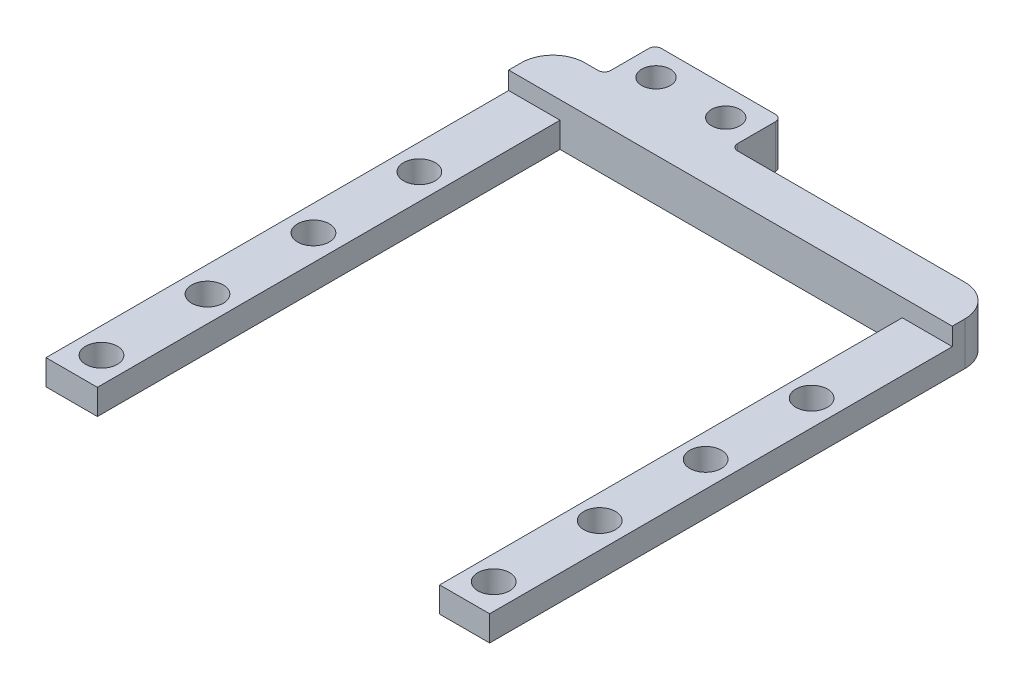
ISO-10303-21;
HEADER;
FILE_DESCRIPTION(('STEP AP214'),'2;1');
FILE_NAME('part.step','',(''),(''),'','','');
FILE_SCHEMA(('AUTOMOTIVE_DESIGN { 1 0 10303 214 1 1 1 1 }'));
ENDSEC;
DATA;
#1=APPLICATION_CONTEXT('core data for automotive mechanical design processes');
#2=APPLICATION_PROTOCOL_DEFINITION('international standard','automotive_design',2000,#1);
#3=PRODUCT_CONTEXT('',#1,'mechanical');
#4=PRODUCT('Part','Part','',(#3));
#5=PRODUCT_RELATED_PRODUCT_CATEGORY('part','',(#4));
#6=PRODUCT_DEFINITION_FORMATION('','',#4);
#7=PRODUCT_DEFINITION_CONTEXT('part definition',#1,'design');
#8=PRODUCT_DEFINITION('design','',#6,#7);
#9=PRODUCT_DEFINITION_SHAPE('','',#8);
#10=(LENGTH_UNIT() NAMED_UNIT(*) SI_UNIT(.MILLI.,.METRE.));
#11=(NAMED_UNIT(*) PLANE_ANGLE_UNIT() SI_UNIT($,.RADIAN.));
#12=(NAMED_UNIT(*) SI_UNIT($,.STERADIAN.) SOLID_ANGLE_UNIT());
#13=UNCERTAINTY_MEASURE_WITH_UNIT(LENGTH_MEASURE(1.E-05),#10,'distance_accuracy_value','');
#14=(GEOMETRIC_REPRESENTATION_CONTEXT(3) GLOBAL_UNCERTAINTY_ASSIGNED_CONTEXT((#13)) GLOBAL_UNIT_ASSIGNED_CONTEXT((#10,
#11,#12)) REPRESENTATION_CONTEXT('',''));
#15=CARTESIAN_POINT('',(0.,0.,0.));
#16=DIRECTION('',(0.,0.,1.));
#17=DIRECTION('',(1.,0.,0.));
#18=AXIS2_PLACEMENT_3D('',#15,#16,#17);
#19=CARTESIAN_POINT('',(0.,6.8,0.));
#20=DIRECTION('',(0.,0.,-1.));
#21=DIRECTION('',(-1.,0.,0.));
#22=AXIS2_PLACEMENT_3D('',#19,#20,#21);
#23=PLANE('',#22);
#24=DIRECTION('',(1.,0.,0.));
#25=VECTOR('',#24,1.);
#26=CARTESIAN_POINT('',(0.,6.8,0.));
#27=LINE('',#26,#25);
#28=CARTESIAN_POINT('',(29.11,6.8,0.));
#29=VERTEX_POINT('',#28);
#30=CARTESIAN_POINT('',(65.,6.8,0.));
#31=VERTEX_POINT('',#30);
#32=EDGE_CURVE('E282',#29,#31,#27,.T.);
#33=ORIENTED_EDGE('',*,*,#32,.T.);
#34=DIRECTION('',(0.,-1.,0.));
#35=VECTOR('',#34,1.);
#36=CARTESIAN_POINT('',(65.,6.8,0.));
#37=LINE('',#36,#35);
#38=CARTESIAN_POINT('',(65.,0.,0.));
#39=VERTEX_POINT('',#38);
#40=EDGE_CURVE('E45',#31,#39,#37,.T.);
#41=ORIENTED_EDGE('',*,*,#40,.T.);
#42=DIRECTION('',(1.,0.,0.));
#43=VECTOR('',#42,1.);
#44=CARTESIAN_POINT('',(0.,0.,0.));
#45=LINE('',#44,#43);
#46=CARTESIAN_POINT('',(29.11,0.,0.));
#47=VERTEX_POINT('',#46);
#48=EDGE_CURVE('E270',#47,#39,#45,.T.);
#49=ORIENTED_EDGE('',*,*,#48,.F.);
#50=DIRECTION('',(0.,1.,0.));
#51=VECTOR('',#50,1.);
#52=CARTESIAN_POINT('',(29.11,6.8,0.));
#53=LINE('',#52,#51);
#54=EDGE_CURVE('E336',#47,#29,#53,.T.);
#55=ORIENTED_EDGE('',*,*,#54,.T.);
#56=EDGE_LOOP('',(#33,#41,#49,#55));
#57=FACE_BOUND('',#56,.T.);
#58=ADVANCED_FACE('F37',(#57),#23,.T.);
#59=CARTESIAN_POINT('',(0.,6.8,0.));
#60=DIRECTION('',(0.,-1.,0.));
#61=DIRECTION('',(0.,0.,-1.));
#62=AXIS2_PLACEMENT_3D('',#59,#60,#61);
#63=PLANE('',#62);
#64=CARTESIAN_POINT('',(23.6256062550604,6.8,-3.62555008299355));
#65=DIRECTION('',(0.,1.,0.));
#66=DIRECTION('',(0.,0.,1.));
#67=AXIS2_PLACEMENT_3D('',#64,#65,#66);
#68=CIRCLE('',#67,2.25);
#69=CARTESIAN_POINT('',(23.6256062550604,6.8,-1.37555008299355));
#70=VERTEX_POINT('',#69);
#71=EDGE_CURVE('E411',#70,#70,#68,.T.);
#72=ORIENTED_EDGE('',*,*,#71,.F.);
#73=EDGE_LOOP('',(#72));
#74=FACE_BOUND('',#73,.T.);
#75=CARTESIAN_POINT('',(12.6256062550604,6.8,-3.62555008299355));
#76=DIRECTION('',(0.,1.,0.));
#77=DIRECTION('',(0.,0.,1.));
#78=AXIS2_PLACEMENT_3D('',#75,#76,#77);
#79=CIRCLE('',#78,2.25);
#80=CARTESIAN_POINT('',(12.6256062550604,6.8,-1.37555008299355));
#81=VERTEX_POINT('',#80);
#82=EDGE_CURVE('E405',#81,#81,#79,.T.);
#83=ORIENTED_EDGE('',*,*,#82,.F.);
#84=EDGE_LOOP('',(#83));
#85=FACE_BOUND('',#84,.T.);
#86=CARTESIAN_POINT('',(5.,6.8,0.));
#87=VERTEX_POINT('',#86);
#88=CARTESIAN_POINT('',(7.11000000000001,6.8,0.));
#89=VERTEX_POINT('',#88);
#90=EDGE_CURVE('E286',#87,#89,#27,.T.);
#91=ORIENTED_EDGE('',*,*,#90,.F.);
#92=CARTESIAN_POINT('',(5.,6.8,5.));
#93=DIRECTION('',(0.,-1.,0.));
#94=DIRECTION('',(0.,0.,-1.));
#95=AXIS2_PLACEMENT_3D('',#92,#93,#94);
#96=CIRCLE('',#95,5.);
#97=CARTESIAN_POINT('',(0.,6.8,5.));
#98=VERTEX_POINT('',#97);
#99=EDGE_CURVE('E294',#87,#98,#96,.F.);
#100=ORIENTED_EDGE('',*,*,#99,.T.);
#101=DIRECTION('',(0.,0.,1.));
#102=VECTOR('',#101,1.);
#103=CARTESIAN_POINT('',(0.,6.8,0.));
#104=LINE('',#103,#102);
#105=CARTESIAN_POINT('',(0.,6.8,7.00000000000001));
#106=VERTEX_POINT('',#105);
#107=EDGE_CURVE('E325',#98,#106,#104,.T.);
#108=ORIENTED_EDGE('',*,*,#107,.T.);
#109=DIRECTION('',(-1.,0.,0.));
#110=VECTOR('',#109,1.);
#111=CARTESIAN_POINT('',(8.11000000000001,6.8,7.00000000000001));
#112=LINE('',#111,#110);
#113=CARTESIAN_POINT('',(70.,6.8,7.00000000000001));
#114=VERTEX_POINT('',#113);
#115=EDGE_CURVE('E255',#114,#106,#112,.T.);
#116=ORIENTED_EDGE('',*,*,#115,.F.);
#117=DIRECTION('',(0.,0.,1.));
#118=VECTOR('',#117,1.);
#119=CARTESIAN_POINT('',(70.,6.8,0.));
#120=LINE('',#119,#118);
#121=CARTESIAN_POINT('',(70.,6.8,5.));
#122=VERTEX_POINT('',#121);
#123=EDGE_CURVE('E195',#122,#114,#120,.T.);
#124=ORIENTED_EDGE('',*,*,#123,.F.);
#125=CARTESIAN_POINT('',(65.,6.8,5.));
#126=DIRECTION('',(0.,-1.,0.));
#127=DIRECTION('',(0.,0.,-1.));
#128=AXIS2_PLACEMENT_3D('',#125,#126,#127);
#129=CIRCLE('',#128,5.);
#130=EDGE_CURVE('E52',#122,#31,#129,.F.);
#131=ORIENTED_EDGE('',*,*,#130,.T.);
#132=ORIENTED_EDGE('',*,*,#32,.F.);
#133=CARTESIAN_POINT('',(29.11,6.8,-1.));
#134=DIRECTION('',(0.,-1.,0.));
#135=DIRECTION('',(0.,0.,-1.));
#136=AXIS2_PLACEMENT_3D('',#133,#134,#135);
#137=CIRCLE('',#136,1.);
#138=CARTESIAN_POINT('',(28.11,6.8,-1.));
#139=VERTEX_POINT('',#138);
#140=EDGE_CURVE('E335',#29,#139,#137,.T.);
#141=ORIENTED_EDGE('',*,*,#140,.T.);
#142=DIRECTION('',(0.,0.,-1.));
#143=VECTOR('',#142,1.);
#144=CARTESIAN_POINT('',(28.11,6.8,0.));
#145=LINE('',#144,#143);
#146=CARTESIAN_POINT('',(28.11,6.8,-7.));
#147=VERTEX_POINT('',#146);
#148=EDGE_CURVE('E361',#139,#147,#145,.T.);
#149=ORIENTED_EDGE('',*,*,#148,.T.);
#150=CARTESIAN_POINT('',(27.11,6.8,-7.));
#151=DIRECTION('',(0.,-1.,0.));
#152=DIRECTION('',(0.,0.,-1.));
#153=AXIS2_PLACEMENT_3D('',#150,#151,#152);
#154=CIRCLE('',#153,1.);
#155=CARTESIAN_POINT('',(27.11,6.8,-8.));
#156=VERTEX_POINT('',#155);
#157=EDGE_CURVE('E357',#147,#156,#154,.F.);
#158=ORIENTED_EDGE('',*,*,#157,.T.);
#159=DIRECTION('',(1.,0.,0.));
#160=VECTOR('',#159,1.);
#161=CARTESIAN_POINT('',(8.11000000000001,6.8,-8.));
#162=LINE('',#161,#160);
#163=CARTESIAN_POINT('',(9.11000000000001,6.8,-8.));
#164=VERTEX_POINT('',#163);
#165=EDGE_CURVE('E364',#164,#156,#162,.T.);
#166=ORIENTED_EDGE('',*,*,#165,.F.);
#167=CARTESIAN_POINT('',(9.11000000000001,6.8,-7.));
#168=DIRECTION('',(0.,-1.,0.));
#169=DIRECTION('',(0.,0.,-1.));
#170=AXIS2_PLACEMENT_3D('',#167,#168,#169);
#171=CIRCLE('',#170,1.);
#172=CARTESIAN_POINT('',(8.11000000000001,6.8,-7.));
#173=VERTEX_POINT('',#172);
#174=EDGE_CURVE('E352',#164,#173,#171,.F.);
#175=ORIENTED_EDGE('',*,*,#174,.T.);
#176=DIRECTION('',(0.,0.,-1.));
#177=VECTOR('',#176,1.);
#178=CARTESIAN_POINT('',(8.11000000000001,6.8,0.));
#179=LINE('',#178,#177);
#180=CARTESIAN_POINT('',(8.11000000000001,6.8,-1.));
#181=VERTEX_POINT('',#180);
#182=EDGE_CURVE('E377',#181,#173,#179,.T.);
#183=ORIENTED_EDGE('',*,*,#182,.F.);
#184=CARTESIAN_POINT('',(7.11000000000001,6.8,-1.));
#185=DIRECTION('',(0.,-1.,0.));
#186=DIRECTION('',(0.,0.,-1.));
#187=AXIS2_PLACEMENT_3D('',#184,#185,#186);
#188=CIRCLE('',#187,1.);
#189=EDGE_CURVE('E385',#181,#89,#188,.T.);
#190=ORIENTED_EDGE('',*,*,#189,.T.);
#191=EDGE_LOOP('',(#91,#100,#108,#116,#124,#131,#132,#141,#149,#158,#166,#175,#183,#190));
#192=FACE_BOUND('',#191,.T.);
#193=ADVANCED_FACE('F400',(#74,#85,#192),#63,.F.);
#194=CARTESIAN_POINT('',(70.,6.8,0.));
#195=DIRECTION('',(1.,0.,0.));
#196=DIRECTION('',(0.,0.,-1.));
#197=AXIS2_PLACEMENT_3D('',#194,#195,#196);
#198=PLANE('',#197);
#199=DIRECTION('',(0.,0.,1.));
#200=VECTOR('',#199,1.);
#201=CARTESIAN_POINT('',(70.,0.,0.));
#202=LINE('',#201,#200);
#203=CARTESIAN_POINT('',(70.,0.,5.));
#204=VERTEX_POINT('',#203);
#205=CARTESIAN_POINT('',(70.,0.,80.));
#206=VERTEX_POINT('',#205);
#207=EDGE_CURVE('E313',#204,#206,#202,.T.);
#208=ORIENTED_EDGE('',*,*,#207,.F.);
#209=DIRECTION('',(0.,-1.,0.));
#210=VECTOR('',#209,1.);
#211=CARTESIAN_POINT('',(70.,6.8,5.));
#212=LINE('',#211,#210);
#213=EDGE_CURVE('E11',#204,#122,#212,.F.);
#214=ORIENTED_EDGE('',*,*,#213,.T.);
#215=ORIENTED_EDGE('',*,*,#123,.T.);
#216=DIRECTION('',(0.,1.,0.));
#217=VECTOR('',#216,1.);
#218=CARTESIAN_POINT('',(70.,4.,7.00000000000001));
#219=LINE('',#218,#217);
#220=CARTESIAN_POINT('',(70.,4.,7.00000000000001));
#221=VERTEX_POINT('',#220);
#222=EDGE_CURVE('E179',#221,#114,#219,.T.);
#223=ORIENTED_EDGE('',*,*,#222,.F.);
#224=DIRECTION('',(0.,0.,1.));
#225=VECTOR('',#224,1.);
#226=CARTESIAN_POINT('',(70.,4.,80.));
#227=LINE('',#226,#225);
#228=CARTESIAN_POINT('',(70.,4.,80.));
#229=VERTEX_POINT('',#228);
#230=EDGE_CURVE('E185',#221,#229,#227,.T.);
#231=ORIENTED_EDGE('',*,*,#230,.T.);
#232=DIRECTION('',(0.,-1.,0.));
#233=VECTOR('',#232,1.);
#234=CARTESIAN_POINT('',(70.,6.8,80.));
#235=LINE('',#234,#233);
#236=EDGE_CURVE('E470',#229,#206,#235,.T.);
#237=ORIENTED_EDGE('',*,*,#236,.T.);
#238=EDGE_LOOP('',(#208,#214,#215,#223,#231,#237));
#239=FACE_BOUND('',#238,.T.);
#240=ADVANCED_FACE('F194',(#239),#198,.T.);
#241=CARTESIAN_POINT('',(0.,0.,0.));
#242=DIRECTION('',(0.,-1.,0.));
#243=DIRECTION('',(0.,0.,-1.));
#244=AXIS2_PLACEMENT_3D('',#241,#242,#243);
#245=PLANE('',#244);
#246=CARTESIAN_POINT('',(23.6256062550604,0.,-3.62555008299355));
#247=DIRECTION('',(0.,1.,0.));
#248=DIRECTION('',(0.,0.,1.));
#249=AXIS2_PLACEMENT_3D('',#246,#247,#248);
#250=CIRCLE('',#249,2.25);
#251=CARTESIAN_POINT('',(23.6256062550604,0.,-1.37555008299355));
#252=VERTEX_POINT('',#251);
#253=EDGE_CURVE('E408',#252,#252,#250,.T.);
#254=ORIENTED_EDGE('',*,*,#253,.T.);
#255=EDGE_LOOP('',(#254));
#256=FACE_BOUND('',#255,.T.);
#257=CARTESIAN_POINT('',(12.6256062550604,0.,-3.62555008299355));
#258=DIRECTION('',(0.,1.,0.));
#259=DIRECTION('',(0.,0.,1.));
#260=AXIS2_PLACEMENT_3D('',#257,#258,#259);
#261=CIRCLE('',#260,2.25);
#262=CARTESIAN_POINT('',(12.6256062550604,0.,-1.37555008299355));
#263=VERTEX_POINT('',#262);
#264=EDGE_CURVE('E365',#263,#263,#261,.T.);
#265=ORIENTED_EDGE('',*,*,#264,.T.);
#266=EDGE_LOOP('',(#265));
#267=FACE_BOUND('',#266,.T.);
#268=CARTESIAN_POINT('',(65.945,0.,41.86));
#269=DIRECTION('',(0.,-1.,0.));
#270=DIRECTION('',(0.,0.,1.));
#271=AXIS2_PLACEMENT_3D('',#268,#269,#270);
#272=CIRCLE('',#271,2.5);
#273=CARTESIAN_POINT('',(65.945,0.,44.36));
#274=VERTEX_POINT('',#273);
#275=EDGE_CURVE('E240',#274,#274,#272,.T.);
#276=ORIENTED_EDGE('',*,*,#275,.F.);
#277=EDGE_LOOP('',(#276));
#278=FACE_BOUND('',#277,.T.);
#279=CARTESIAN_POINT('',(65.945,0.,75.3));
#280=DIRECTION('',(0.,-1.,0.));
#281=DIRECTION('',(0.,0.,1.));
#282=AXIS2_PLACEMENT_3D('',#279,#280,#281);
#283=CIRCLE('',#282,2.5);
#284=CARTESIAN_POINT('',(65.945,0.,77.8));
#285=VERTEX_POINT('',#284);
#286=EDGE_CURVE('E246',#285,#285,#283,.T.);
#287=ORIENTED_EDGE('',*,*,#286,.F.);
#288=EDGE_LOOP('',(#287));
#289=FACE_BOUND('',#288,.T.);
#290=CARTESIAN_POINT('',(4.05500000000001,0.,58.58));
#291=DIRECTION('',(0.,1.,0.));
#292=DIRECTION('',(0.,0.,1.));
#293=AXIS2_PLACEMENT_3D('',#290,#291,#292);
#294=CIRCLE('',#293,2.5);
#295=CARTESIAN_POINT('',(4.05500000000001,0.,61.08));
#296=VERTEX_POINT('',#295);
#297=EDGE_CURVE('E249',#296,#296,#294,.T.);
#298=ORIENTED_EDGE('',*,*,#297,.T.);
#299=EDGE_LOOP('',(#298));
#300=FACE_BOUND('',#299,.T.);
#301=CARTESIAN_POINT('',(4.05500000000001,0.,75.3));
#302=DIRECTION('',(0.,1.,0.));
#303=DIRECTION('',(0.,0.,1.));
#304=AXIS2_PLACEMENT_3D('',#301,#302,#303);
#305=CIRCLE('',#304,2.5);
#306=CARTESIAN_POINT('',(4.05500000000001,0.,77.8));
#307=VERTEX_POINT('',#306);
#308=EDGE_CURVE('E252',#307,#307,#305,.T.);
#309=ORIENTED_EDGE('',*,*,#308,.T.);
#310=EDGE_LOOP('',(#309));
#311=FACE_BOUND('',#310,.T.);
#312=DIRECTION('',(0.,0.,1.));
#313=VECTOR('',#312,1.);
#314=CARTESIAN_POINT('',(0.,0.,0.));
#315=LINE('',#314,#313);
#316=CARTESIAN_POINT('',(0.,0.,5.));
#317=VERTEX_POINT('',#316);
#318=CARTESIAN_POINT('',(0.,0.,80.));
#319=VERTEX_POINT('',#318);
#320=EDGE_CURVE('E526',#317,#319,#315,.T.);
#321=ORIENTED_EDGE('',*,*,#320,.F.);
#322=CARTESIAN_POINT('',(5.,0.,5.));
#323=DIRECTION('',(0.,-1.,0.));
#324=DIRECTION('',(0.,0.,-1.));
#325=AXIS2_PLACEMENT_3D('',#322,#323,#324);
#326=CIRCLE('',#325,5.);
#327=CARTESIAN_POINT('',(5.,0.,0.));
#328=VERTEX_POINT('',#327);
#329=EDGE_CURVE('E289',#317,#328,#326,.T.);
#330=ORIENTED_EDGE('',*,*,#329,.T.);
#331=CARTESIAN_POINT('',(7.11000000000001,0.,0.));
#332=VERTEX_POINT('',#331);
#333=EDGE_CURVE('E311',#328,#332,#45,.T.);
#334=ORIENTED_EDGE('',*,*,#333,.T.);
#335=CARTESIAN_POINT('',(7.11000000000001,0.,-1.));
#336=DIRECTION('',(0.,-1.,0.));
#337=DIRECTION('',(0.,0.,-1.));
#338=AXIS2_PLACEMENT_3D('',#335,#336,#337);
#339=CIRCLE('',#338,1.);
#340=CARTESIAN_POINT('',(8.11000000000001,0.,-1.));
#341=VERTEX_POINT('',#340);
#342=EDGE_CURVE('E388',#332,#341,#339,.F.);
#343=ORIENTED_EDGE('',*,*,#342,.T.);
#344=DIRECTION('',(0.,0.,-1.));
#345=VECTOR('',#344,1.);
#346=CARTESIAN_POINT('',(8.11000000000001,0.,0.));
#347=LINE('',#346,#345);
#348=CARTESIAN_POINT('',(8.11000000000001,0.,-7.));
#349=VERTEX_POINT('',#348);
#350=EDGE_CURVE('E192',#341,#349,#347,.T.);
#351=ORIENTED_EDGE('',*,*,#350,.T.);
#352=CARTESIAN_POINT('',(9.11000000000001,0.,-7.));
#353=DIRECTION('',(0.,-1.,0.));
#354=DIRECTION('',(0.,0.,-1.));
#355=AXIS2_PLACEMENT_3D('',#352,#353,#354);
#356=CIRCLE('',#355,1.);
#357=CARTESIAN_POINT('',(9.11000000000001,0.,-8.));
#358=VERTEX_POINT('',#357);
#359=EDGE_CURVE('E344',#349,#358,#356,.T.);
#360=ORIENTED_EDGE('',*,*,#359,.T.);
#361=DIRECTION('',(1.,0.,0.));
#362=VECTOR('',#361,1.);
#363=CARTESIAN_POINT('',(8.11000000000001,0.,-8.));
#364=LINE('',#363,#362);
#365=CARTESIAN_POINT('',(27.11,0.,-8.));
#366=VERTEX_POINT('',#365);
#367=EDGE_CURVE('E376',#358,#366,#364,.T.);
#368=ORIENTED_EDGE('',*,*,#367,.T.);
#369=CARTESIAN_POINT('',(27.11,0.,-7.));
#370=DIRECTION('',(0.,-1.,0.));
#371=DIRECTION('',(0.,0.,-1.));
#372=AXIS2_PLACEMENT_3D('',#369,#370,#371);
#373=CIRCLE('',#372,1.);
#374=CARTESIAN_POINT('',(28.11,0.,-7.));
#375=VERTEX_POINT('',#374);
#376=EDGE_CURVE('E321',#366,#375,#373,.T.);
#377=ORIENTED_EDGE('',*,*,#376,.T.);
#378=DIRECTION('',(0.,0.,-1.));
#379=VECTOR('',#378,1.);
#380=CARTESIAN_POINT('',(28.11,0.,0.));
#381=LINE('',#380,#379);
#382=CARTESIAN_POINT('',(28.11,0.,-1.));
#383=VERTEX_POINT('',#382);
#384=EDGE_CURVE('E318',#383,#375,#381,.T.);
#385=ORIENTED_EDGE('',*,*,#384,.F.);
#386=CARTESIAN_POINT('',(29.11,0.,-1.));
#387=DIRECTION('',(0.,-1.,0.));
#388=DIRECTION('',(0.,0.,-1.));
#389=AXIS2_PLACEMENT_3D('',#386,#387,#388);
#390=CIRCLE('',#389,1.);
#391=EDGE_CURVE('E310',#383,#47,#390,.F.);
#392=ORIENTED_EDGE('',*,*,#391,.T.);
#393=ORIENTED_EDGE('',*,*,#48,.T.);
#394=CARTESIAN_POINT('',(65.,0.,5.));
#395=DIRECTION('',(0.,-1.,0.));
#396=DIRECTION('',(0.,0.,-1.));
#397=AXIS2_PLACEMENT_3D('',#394,#395,#396);
#398=CIRCLE('',#397,5.);
#399=EDGE_CURVE('E307',#39,#204,#398,.T.);
#400=ORIENTED_EDGE('',*,*,#399,.T.);
#401=ORIENTED_EDGE('',*,*,#207,.T.);
#402=DIRECTION('',(1.,0.,0.));
#403=VECTOR('',#402,1.);
#404=CARTESIAN_POINT('',(0.,0.,80.));
#405=LINE('',#404,#403);
#406=CARTESIAN_POINT('',(62.11,0.,80.));
#407=VERTEX_POINT('',#406);
#408=EDGE_CURVE('E523',#407,#206,#405,.T.);
#409=ORIENTED_EDGE('',*,*,#408,.F.);
#410=DIRECTION('',(0.,0.,-1.));
#411=VECTOR('',#410,1.);
#412=CARTESIAN_POINT('',(62.11,0.,80.));
#413=LINE('',#412,#411);
#414=CARTESIAN_POINT('',(62.11,0.,7.00000000000001));
#415=VERTEX_POINT('',#414);
#416=EDGE_CURVE('E259',#407,#415,#413,.T.);
#417=ORIENTED_EDGE('',*,*,#416,.T.);
#418=DIRECTION('',(-1.,0.,0.));
#419=VECTOR('',#418,1.);
#420=CARTESIAN_POINT('',(8.11000000000001,0.,7.00000000000001));
#421=LINE('',#420,#419);
#422=CARTESIAN_POINT('',(8.11000000000001,0.,7.00000000000001));
#423=VERTEX_POINT('',#422);
#424=EDGE_CURVE('E262',#415,#423,#421,.T.);
#425=ORIENTED_EDGE('',*,*,#424,.T.);
#426=DIRECTION('',(0.,0.,1.));
#427=VECTOR('',#426,1.);
#428=CARTESIAN_POINT('',(8.11000000000001,0.,80.));
#429=LINE('',#428,#427);
#430=CARTESIAN_POINT('',(8.11000000000001,0.,80.));
#431=VERTEX_POINT('',#430);
#432=EDGE_CURVE('E256',#423,#431,#429,.T.);
#433=ORIENTED_EDGE('',*,*,#432,.T.);
#434=EDGE_CURVE('E524',#319,#431,#405,.T.);
#435=ORIENTED_EDGE('',*,*,#434,.F.);
#436=EDGE_LOOP('',(#321,#330,#334,#343,#351,#360,#368,#377,#385,#392,#393,#400,#401,#409,#417,
#425,#433,#435));
#437=FACE_BOUND('',#436,.T.);
#438=CARTESIAN_POINT('',(4.05500000000001,0.,41.86));
#439=DIRECTION('',(0.,1.,0.));
#440=DIRECTION('',(0.,0.,1.));
#441=AXIS2_PLACEMENT_3D('',#438,#439,#440);
#442=CIRCLE('',#441,2.5);
#443=CARTESIAN_POINT('',(4.05500000000001,0.,44.36));
#444=VERTEX_POINT('',#443);
#445=EDGE_CURVE('E475',#444,#444,#442,.T.);
#446=ORIENTED_EDGE('',*,*,#445,.T.);
#447=EDGE_LOOP('',(#446));
#448=FACE_BOUND('',#447,.T.);
#449=CARTESIAN_POINT('',(4.055,0.,25.14));
#450=DIRECTION('',(0.,1.,0.));
#451=DIRECTION('',(0.,0.,1.));
#452=AXIS2_PLACEMENT_3D('',#449,#450,#451);
#453=CIRCLE('',#452,2.5);
#454=CARTESIAN_POINT('',(4.055,0.,27.64));
#455=VERTEX_POINT('',#454);
#456=EDGE_CURVE('E382',#455,#455,#453,.T.);
#457=ORIENTED_EDGE('',*,*,#456,.T.);
#458=EDGE_LOOP('',(#457));
#459=FACE_BOUND('',#458,.T.);
#460=CARTESIAN_POINT('',(65.945,0.,58.58));
#461=DIRECTION('',(0.,-1.,0.));
#462=DIRECTION('',(0.,0.,1.));
#463=AXIS2_PLACEMENT_3D('',#460,#461,#462);
#464=CIRCLE('',#463,2.5);
#465=CARTESIAN_POINT('',(65.945,0.,61.08));
#466=VERTEX_POINT('',#465);
#467=EDGE_CURVE('E243',#466,#466,#464,.T.);
#468=ORIENTED_EDGE('',*,*,#467,.F.);
#469=EDGE_LOOP('',(#468));
#470=FACE_BOUND('',#469,.T.);
#471=CARTESIAN_POINT('',(65.945,0.,25.14));
#472=DIRECTION('',(0.,-1.,0.));
#473=DIRECTION('',(0.,0.,1.));
#474=AXIS2_PLACEMENT_3D('',#471,#472,#473);
#475=CIRCLE('',#474,2.5);
#476=CARTESIAN_POINT('',(65.945,0.,27.64));
#477=VERTEX_POINT('',#476);
#478=EDGE_CURVE('E237',#477,#477,#475,.T.);
#479=ORIENTED_EDGE('',*,*,#478,.F.);
#480=EDGE_LOOP('',(#479));
#481=FACE_BOUND('',#480,.T.);
#482=ADVANCED_FACE('F305',(#256,#267,#278,#289,#300,#311,#437,#448,#459,#470,#481),#245,.T.);
#483=CARTESIAN_POINT('',(0.,6.8,80.));
#484=DIRECTION('',(0.,0.,-1.));
#485=DIRECTION('',(-1.,0.,0.));
#486=AXIS2_PLACEMENT_3D('',#483,#484,#485);
#487=PLANE('',#486);
#488=DIRECTION('',(0.,1.,0.));
#489=VECTOR('',#488,1.);
#490=CARTESIAN_POINT('',(8.11000000000001,0.,80.));
#491=LINE('',#490,#489);
#492=CARTESIAN_POINT('',(8.11000000000001,4.,80.));
#493=VERTEX_POINT('',#492);
#494=EDGE_CURVE('E265',#431,#493,#491,.T.);
#495=ORIENTED_EDGE('',*,*,#494,.T.);
#496=DIRECTION('',(1.,0.,0.));
#497=VECTOR('',#496,1.);
#498=CARTESIAN_POINT('',(0.,4.,80.));
#499=LINE('',#498,#497);
#500=CARTESIAN_POINT('',(0.,4.,80.));
#501=VERTEX_POINT('',#500);
#502=EDGE_CURVE('E216',#501,#493,#499,.T.);
#503=ORIENTED_EDGE('',*,*,#502,.F.);
#504=DIRECTION('',(0.,-1.,0.));
#505=VECTOR('',#504,1.);
#506=CARTESIAN_POINT('',(0.,6.8,80.));
#507=LINE('',#506,#505);
#508=EDGE_CURVE('E471',#501,#319,#507,.T.);
#509=ORIENTED_EDGE('',*,*,#508,.T.);
#510=ORIENTED_EDGE('',*,*,#434,.T.);
#511=EDGE_LOOP('',(#495,#503,#509,#510));
#512=FACE_BOUND('',#511,.T.);
#513=ADVANCED_FACE('F452',(#512),#487,.F.);
#514=ORIENTED_EDGE('',*,*,#333,.F.);
#515=DIRECTION('',(0.,-1.,0.));
#516=VECTOR('',#515,1.);
#517=CARTESIAN_POINT('',(5.,6.8,0.));
#518=LINE('',#517,#516);
#519=EDGE_CURVE('E291',#328,#87,#518,.F.);
#520=ORIENTED_EDGE('',*,*,#519,.T.);
#521=ORIENTED_EDGE('',*,*,#90,.T.);
#522=DIRECTION('',(0.,1.,0.));
#523=VECTOR('',#522,1.);
#524=CARTESIAN_POINT('',(7.11000000000001,6.8,0.));
#525=LINE('',#524,#523);
#526=EDGE_CURVE('E381',#89,#332,#525,.F.);
#527=ORIENTED_EDGE('',*,*,#526,.T.);
#528=EDGE_LOOP('',(#514,#520,#521,#527));
#529=FACE_BOUND('',#528,.T.);
#530=ADVANCED_FACE('F445',(#529),#23,.T.);
#531=CARTESIAN_POINT('',(0.,6.8,0.));
#532=DIRECTION('',(1.,0.,0.));
#533=DIRECTION('',(0.,0.,-1.));
#534=AXIS2_PLACEMENT_3D('',#531,#532,#533);
#535=PLANE('',#534);
#536=ORIENTED_EDGE('',*,*,#107,.F.);
#537=DIRECTION('',(0.,-1.,0.));
#538=VECTOR('',#537,1.);
#539=CARTESIAN_POINT('',(0.,0.,5.));
#540=LINE('',#539,#538);
#541=EDGE_CURVE('E329',#98,#317,#540,.T.);
#542=ORIENTED_EDGE('',*,*,#541,.T.);
#543=ORIENTED_EDGE('',*,*,#320,.T.);
#544=ORIENTED_EDGE('',*,*,#508,.F.);
#545=DIRECTION('',(0.,0.,1.));
#546=VECTOR('',#545,1.);
#547=CARTESIAN_POINT('',(0.,4.,80.));
#548=LINE('',#547,#546);
#549=CARTESIAN_POINT('',(0.,4.,7.00000000000001));
#550=VERTEX_POINT('',#549);
#551=EDGE_CURVE('E214',#550,#501,#548,.T.);
#552=ORIENTED_EDGE('',*,*,#551,.F.);
#553=DIRECTION('',(0.,1.,0.));
#554=VECTOR('',#553,1.);
#555=CARTESIAN_POINT('',(0.,4.,7.00000000000001));
#556=LINE('',#555,#554);
#557=EDGE_CURVE('E224',#550,#106,#556,.T.);
#558=ORIENTED_EDGE('',*,*,#557,.T.);
#559=EDGE_LOOP('',(#536,#542,#543,#544,#552,#558));
#560=FACE_BOUND('',#559,.T.);
#561=ADVANCED_FACE('F451',(#560),#535,.F.);
#562=ORIENTED_EDGE('',*,*,#236,.F.);
#563=DIRECTION('',(-1.,0.,0.));
#564=VECTOR('',#563,1.);
#565=CARTESIAN_POINT('',(70.,4.,80.));
#566=LINE('',#565,#564);
#567=CARTESIAN_POINT('',(62.11,4.,80.));
#568=VERTEX_POINT('',#567);
#569=EDGE_CURVE('E184',#229,#568,#566,.T.);
#570=ORIENTED_EDGE('',*,*,#569,.T.);
#571=DIRECTION('',(0.,1.,0.));
#572=VECTOR('',#571,1.);
#573=CARTESIAN_POINT('',(62.11,0.,80.));
#574=LINE('',#573,#572);
#575=EDGE_CURVE('E272',#407,#568,#574,.T.);
#576=ORIENTED_EDGE('',*,*,#575,.F.);
#577=ORIENTED_EDGE('',*,*,#408,.T.);
#578=EDGE_LOOP('',(#562,#570,#576,#577));
#579=FACE_BOUND('',#578,.T.);
#580=ADVANCED_FACE('F458',(#579),#487,.F.);
#581=CARTESIAN_POINT('',(8.11000000000001,0.,80.));
#582=DIRECTION('',(-1.,0.,0.));
#583=DIRECTION('',(0.,0.,1.));
#584=AXIS2_PLACEMENT_3D('',#581,#582,#583);
#585=PLANE('',#584);
#586=DIRECTION('',(0.,1.,0.));
#587=VECTOR('',#586,1.);
#588=CARTESIAN_POINT('',(8.11000000000001,0.,7.00000000000001));
#589=LINE('',#588,#587);
#590=CARTESIAN_POINT('',(8.11000000000001,4.,7.00000000000001));
#591=VERTEX_POINT('',#590);
#592=EDGE_CURVE('E267',#423,#591,#589,.T.);
#593=ORIENTED_EDGE('',*,*,#592,.T.);
#594=DIRECTION('',(0.,0.,-1.));
#595=VECTOR('',#594,1.);
#596=CARTESIAN_POINT('',(8.11000000000001,4.,80.));
#597=LINE('',#596,#595);
#598=EDGE_CURVE('E218',#493,#591,#597,.T.);
#599=ORIENTED_EDGE('',*,*,#598,.F.);
#600=ORIENTED_EDGE('',*,*,#494,.F.);
#601=ORIENTED_EDGE('',*,*,#432,.F.);
#602=EDGE_LOOP('',(#593,#599,#600,#601));
#603=FACE_BOUND('',#602,.T.);
#604=ADVANCED_FACE('F515',(#603),#585,.F.);
#605=CARTESIAN_POINT('',(8.11000000000001,0.,7.00000000000001));
#606=DIRECTION('',(0.,0.,-1.));
#607=DIRECTION('',(-1.,0.,0.));
#608=AXIS2_PLACEMENT_3D('',#605,#606,#607);
#609=PLANE('',#608);
#610=ORIENTED_EDGE('',*,*,#115,.T.);
#611=ORIENTED_EDGE('',*,*,#557,.F.);
#612=DIRECTION('',(-1.,0.,0.));
#613=VECTOR('',#612,1.);
#614=CARTESIAN_POINT('',(0.,4.,7.00000000000001));
#615=LINE('',#614,#613);
#616=EDGE_CURVE('E221',#591,#550,#615,.T.);
#617=ORIENTED_EDGE('',*,*,#616,.F.);
#618=ORIENTED_EDGE('',*,*,#592,.F.);
#619=ORIENTED_EDGE('',*,*,#424,.F.);
#620=DIRECTION('',(0.,1.,0.));
#621=VECTOR('',#620,1.);
#622=CARTESIAN_POINT('',(62.11,0.,7.00000000000001));
#623=LINE('',#622,#621);
#624=CARTESIAN_POINT('',(62.11,4.,7.00000000000001));
#625=VERTEX_POINT('',#624);
#626=EDGE_CURVE('E181',#415,#625,#623,.T.);
#627=ORIENTED_EDGE('',*,*,#626,.T.);
#628=DIRECTION('',(1.,0.,0.));
#629=VECTOR('',#628,1.);
#630=CARTESIAN_POINT('',(70.,4.,7.00000000000001));
#631=LINE('',#630,#629);
#632=EDGE_CURVE('E174',#625,#221,#631,.T.);
#633=ORIENTED_EDGE('',*,*,#632,.T.);
#634=ORIENTED_EDGE('',*,*,#222,.T.);
#635=EDGE_LOOP('',(#610,#611,#617,#618,#619,#627,#633,#634));
#636=FACE_BOUND('',#635,.T.);
#637=ADVANCED_FACE('F177',(#636),#609,.F.);
#638=CARTESIAN_POINT('',(62.11,0.,80.));
#639=DIRECTION('',(1.,0.,0.));
#640=DIRECTION('',(0.,0.,-1.));
#641=AXIS2_PLACEMENT_3D('',#638,#639,#640);
#642=PLANE('',#641);
#643=ORIENTED_EDGE('',*,*,#575,.T.);
#644=DIRECTION('',(0.,0.,-1.));
#645=VECTOR('',#644,1.);
#646=CARTESIAN_POINT('',(62.11,4.,80.));
#647=LINE('',#646,#645);
#648=EDGE_CURVE('E212',#568,#625,#647,.T.);
#649=ORIENTED_EDGE('',*,*,#648,.T.);
#650=ORIENTED_EDGE('',*,*,#626,.F.);
#651=ORIENTED_EDGE('',*,*,#416,.F.);
#652=EDGE_LOOP('',(#643,#649,#650,#651));
#653=FACE_BOUND('',#652,.T.);
#654=ADVANCED_FACE('F504',(#653),#642,.F.);
#655=CARTESIAN_POINT('',(4.05500000000001,0.,75.3));
#656=DIRECTION('',(0.,1.,0.));
#657=DIRECTION('',(0.,0.,1.));
#658=AXIS2_PLACEMENT_3D('',#655,#656,#657);
#659=CYLINDRICAL_SURFACE('',#658,2.5);
#660=CARTESIAN_POINT('',(4.05500000000001,4.,75.3));
#661=DIRECTION('',(0.,-1.,0.));
#662=DIRECTION('',(0.,0.,-1.));
#663=AXIS2_PLACEMENT_3D('',#660,#661,#662);
#664=CIRCLE('',#663,2.5);
#665=CARTESIAN_POINT('',(4.05500000000001,4.,72.8));
#666=VERTEX_POINT('',#665);
#667=EDGE_CURVE('E234',#666,#666,#664,.F.);
#668=ORIENTED_EDGE('',*,*,#667,.T.);
#669=EDGE_LOOP('',(#668));
#670=FACE_BOUND('',#669,.T.);
#671=ORIENTED_EDGE('',*,*,#308,.F.);
#672=EDGE_LOOP('',(#671));
#673=FACE_BOUND('',#672,.T.);
#674=ADVANCED_FACE('F500',(#670,#673),#659,.F.);
#675=CARTESIAN_POINT('',(4.05500000000001,0.,58.58));
#676=DIRECTION('',(0.,1.,0.));
#677=DIRECTION('',(0.,0.,1.));
#678=AXIS2_PLACEMENT_3D('',#675,#676,#677);
#679=CYLINDRICAL_SURFACE('',#678,2.5);
#680=CARTESIAN_POINT('',(4.05500000000001,4.,58.58));
#681=DIRECTION('',(0.,-1.,0.));
#682=DIRECTION('',(0.,0.,-1.));
#683=AXIS2_PLACEMENT_3D('',#680,#681,#682);
#684=CIRCLE('',#683,2.5);
#685=CARTESIAN_POINT('',(4.05500000000001,4.,56.08));
#686=VERTEX_POINT('',#685);
#687=EDGE_CURVE('E231',#686,#686,#684,.F.);
#688=ORIENTED_EDGE('',*,*,#687,.T.);
#689=EDGE_LOOP('',(#688));
#690=FACE_BOUND('',#689,.T.);
#691=ORIENTED_EDGE('',*,*,#297,.F.);
#692=EDGE_LOOP('',(#691));
#693=FACE_BOUND('',#692,.T.);
#694=ADVANCED_FACE('F503',(#690,#693),#679,.F.);
#695=CARTESIAN_POINT('',(4.05500000000001,0.,41.86));
#696=DIRECTION('',(0.,1.,0.));
#697=DIRECTION('',(0.,0.,1.));
#698=AXIS2_PLACEMENT_3D('',#695,#696,#697);
#699=CYLINDRICAL_SURFACE('',#698,2.5);
#700=CARTESIAN_POINT('',(4.05500000000001,4.,41.86));
#701=DIRECTION('',(0.,-1.,0.));
#702=DIRECTION('',(0.,0.,-1.));
#703=AXIS2_PLACEMENT_3D('',#700,#701,#702);
#704=CIRCLE('',#703,2.5);
#705=CARTESIAN_POINT('',(4.05500000000001,4.,39.36));
#706=VERTEX_POINT('',#705);
#707=EDGE_CURVE('E228',#706,#706,#704,.F.);
#708=ORIENTED_EDGE('',*,*,#707,.T.);
#709=EDGE_LOOP('',(#708));
#710=FACE_BOUND('',#709,.T.);
#711=ORIENTED_EDGE('',*,*,#445,.F.);
#712=EDGE_LOOP('',(#711));
#713=FACE_BOUND('',#712,.T.);
#714=ADVANCED_FACE('F554',(#710,#713),#699,.F.);
#715=CARTESIAN_POINT('',(4.055,0.,25.14));
#716=DIRECTION('',(0.,1.,0.));
#717=DIRECTION('',(0.,0.,1.));
#718=AXIS2_PLACEMENT_3D('',#715,#716,#717);
#719=CYLINDRICAL_SURFACE('',#718,2.5);
#720=CARTESIAN_POINT('',(4.055,4.,25.14));
#721=DIRECTION('',(0.,-1.,0.));
#722=DIRECTION('',(0.,0.,-1.));
#723=AXIS2_PLACEMENT_3D('',#720,#721,#722);
#724=CIRCLE('',#723,2.5);
#725=CARTESIAN_POINT('',(4.055,4.,22.64));
#726=VERTEX_POINT('',#725);
#727=EDGE_CURVE('E227',#726,#726,#724,.F.);
#728=ORIENTED_EDGE('',*,*,#727,.T.);
#729=EDGE_LOOP('',(#728));
#730=FACE_BOUND('',#729,.T.);
#731=ORIENTED_EDGE('',*,*,#456,.F.);
#732=EDGE_LOOP('',(#731));
#733=FACE_BOUND('',#732,.T.);
#734=ADVANCED_FACE('F485',(#730,#733),#719,.F.);
#735=CARTESIAN_POINT('',(65.945,0.,75.3));
#736=DIRECTION('',(0.,1.,0.));
#737=DIRECTION('',(0.,0.,1.));
#738=AXIS2_PLACEMENT_3D('',#735,#736,#737);
#739=CYLINDRICAL_SURFACE('',#738,2.5);
#740=CARTESIAN_POINT('',(65.945,4.,75.3));
#741=DIRECTION('',(0.,-1.,0.));
#742=DIRECTION('',(0.,0.,-1.));
#743=AXIS2_PLACEMENT_3D('',#740,#741,#742);
#744=CIRCLE('',#743,2.5);
#745=CARTESIAN_POINT('',(65.945,4.,72.8));
#746=VERTEX_POINT('',#745);
#747=EDGE_CURVE('E209',#746,#746,#744,.T.);
#748=ORIENTED_EDGE('',*,*,#747,.F.);
#749=EDGE_LOOP('',(#748));
#750=FACE_BOUND('',#749,.T.);
#751=ORIENTED_EDGE('',*,*,#286,.T.);
#752=EDGE_LOOP('',(#751));
#753=FACE_BOUND('',#752,.T.);
#754=ADVANCED_FACE('F553',(#750,#753),#739,.F.);
#755=CARTESIAN_POINT('',(65.945,0.,58.58));
#756=DIRECTION('',(0.,1.,0.));
#757=DIRECTION('',(0.,0.,1.));
#758=AXIS2_PLACEMENT_3D('',#755,#756,#757);
#759=CYLINDRICAL_SURFACE('',#758,2.5);
#760=CARTESIAN_POINT('',(65.945,4.,58.58));
#761=DIRECTION('',(0.,-1.,0.));
#762=DIRECTION('',(0.,0.,-1.));
#763=AXIS2_PLACEMENT_3D('',#760,#761,#762);
#764=CIRCLE('',#763,2.5);
#765=CARTESIAN_POINT('',(65.945,4.,56.08));
#766=VERTEX_POINT('',#765);
#767=EDGE_CURVE('E206',#766,#766,#764,.T.);
#768=ORIENTED_EDGE('',*,*,#767,.F.);
#769=EDGE_LOOP('',(#768));
#770=FACE_BOUND('',#769,.T.);
#771=ORIENTED_EDGE('',*,*,#467,.T.);
#772=EDGE_LOOP('',(#771));
#773=FACE_BOUND('',#772,.T.);
#774=ADVANCED_FACE('F578',(#770,#773),#759,.F.);
#775=CARTESIAN_POINT('',(65.945,0.,41.86));
#776=DIRECTION('',(0.,1.,0.));
#777=DIRECTION('',(0.,0.,1.));
#778=AXIS2_PLACEMENT_3D('',#775,#776,#777);
#779=CYLINDRICAL_SURFACE('',#778,2.5);
#780=CARTESIAN_POINT('',(65.945,4.,41.86));
#781=DIRECTION('',(0.,-1.,0.));
#782=DIRECTION('',(0.,0.,-1.));
#783=AXIS2_PLACEMENT_3D('',#780,#781,#782);
#784=CIRCLE('',#783,2.5);
#785=CARTESIAN_POINT('',(65.945,4.,39.36));
#786=VERTEX_POINT('',#785);
#787=EDGE_CURVE('E200',#786,#786,#784,.T.);
#788=ORIENTED_EDGE('',*,*,#787,.F.);
#789=EDGE_LOOP('',(#788));
#790=FACE_BOUND('',#789,.T.);
#791=ORIENTED_EDGE('',*,*,#275,.T.);
#792=EDGE_LOOP('',(#791));
#793=FACE_BOUND('',#792,.T.);
#794=ADVANCED_FACE('F572',(#790,#793),#779,.F.);
#795=CARTESIAN_POINT('',(65.945,0.,25.14));
#796=DIRECTION('',(0.,1.,0.));
#797=DIRECTION('',(0.,0.,1.));
#798=AXIS2_PLACEMENT_3D('',#795,#796,#797);
#799=CYLINDRICAL_SURFACE('',#798,2.5);
#800=CARTESIAN_POINT('',(65.945,4.,25.14));
#801=DIRECTION('',(0.,-1.,0.));
#802=DIRECTION('',(0.,0.,-1.));
#803=AXIS2_PLACEMENT_3D('',#800,#801,#802);
#804=CIRCLE('',#803,2.5);
#805=CARTESIAN_POINT('',(65.945,4.,22.64));
#806=VERTEX_POINT('',#805);
#807=EDGE_CURVE('E197',#806,#806,#804,.T.);
#808=ORIENTED_EDGE('',*,*,#807,.F.);
#809=EDGE_LOOP('',(#808));
#810=FACE_BOUND('',#809,.T.);
#811=ORIENTED_EDGE('',*,*,#478,.T.);
#812=EDGE_LOOP('',(#811));
#813=FACE_BOUND('',#812,.T.);
#814=ADVANCED_FACE('F491',(#810,#813),#799,.F.);
#815=CARTESIAN_POINT('',(0.,4.,0.));
#816=DIRECTION('',(0.,-1.,0.));
#817=DIRECTION('',(0.,0.,-1.));
#818=AXIS2_PLACEMENT_3D('',#815,#816,#817);
#819=PLANE('',#818);
#820=ORIENTED_EDGE('',*,*,#687,.F.);
#821=EDGE_LOOP('',(#820));
#822=FACE_BOUND('',#821,.T.);
#823=ORIENTED_EDGE('',*,*,#727,.F.);
#824=EDGE_LOOP('',(#823));
#825=FACE_BOUND('',#824,.T.);
#826=ORIENTED_EDGE('',*,*,#551,.T.);
#827=ORIENTED_EDGE('',*,*,#502,.T.);
#828=ORIENTED_EDGE('',*,*,#598,.T.);
#829=ORIENTED_EDGE('',*,*,#616,.T.);
#830=EDGE_LOOP('',(#826,#827,#828,#829));
#831=FACE_BOUND('',#830,.T.);
#832=ORIENTED_EDGE('',*,*,#707,.F.);
#833=EDGE_LOOP('',(#832));
#834=FACE_BOUND('',#833,.T.);
#835=ORIENTED_EDGE('',*,*,#667,.F.);
#836=EDGE_LOOP('',(#835));
#837=FACE_BOUND('',#836,.T.);
#838=ADVANCED_FACE('F488',(#822,#825,#831,#834,#837),#819,.F.);
#839=CARTESIAN_POINT('',(70.,4.,0.));
#840=DIRECTION('',(0.,-1.,0.));
#841=DIRECTION('',(0.,0.,-1.));
#842=AXIS2_PLACEMENT_3D('',#839,#840,#841);
#843=PLANE('',#842);
#844=ORIENTED_EDGE('',*,*,#807,.T.);
#845=EDGE_LOOP('',(#844));
#846=FACE_BOUND('',#845,.T.);
#847=ORIENTED_EDGE('',*,*,#787,.T.);
#848=EDGE_LOOP('',(#847));
#849=FACE_BOUND('',#848,.T.);
#850=ORIENTED_EDGE('',*,*,#767,.T.);
#851=EDGE_LOOP('',(#850));
#852=FACE_BOUND('',#851,.T.);
#853=ORIENTED_EDGE('',*,*,#747,.T.);
#854=EDGE_LOOP('',(#853));
#855=FACE_BOUND('',#854,.T.);
#856=ORIENTED_EDGE('',*,*,#569,.F.);
#857=ORIENTED_EDGE('',*,*,#230,.F.);
#858=ORIENTED_EDGE('',*,*,#632,.F.);
#859=ORIENTED_EDGE('',*,*,#648,.F.);
#860=EDGE_LOOP('',(#856,#857,#858,#859));
#861=FACE_BOUND('',#860,.T.);
#862=ADVANCED_FACE('F188',(#846,#849,#852,#855,#861),#843,.F.);
#863=CARTESIAN_POINT('',(8.11000000000001,0.,0.));
#864=DIRECTION('',(1.,0.,0.));
#865=DIRECTION('',(0.,0.,-1.));
#866=AXIS2_PLACEMENT_3D('',#863,#864,#865);
#867=PLANE('',#866);
#868=ORIENTED_EDGE('',*,*,#182,.T.);
#869=DIRECTION('',(0.,1.,0.));
#870=VECTOR('',#869,1.);
#871=CARTESIAN_POINT('',(8.11000000000001,0.,-7.));
#872=LINE('',#871,#870);
#873=EDGE_CURVE('E349',#173,#349,#872,.F.);
#874=ORIENTED_EDGE('',*,*,#873,.T.);
#875=ORIENTED_EDGE('',*,*,#350,.F.);
#876=DIRECTION('',(0.,1.,0.));
#877=VECTOR('',#876,1.);
#878=CARTESIAN_POINT('',(8.11000000000001,0.,-1.));
#879=LINE('',#878,#877);
#880=EDGE_CURVE('E378',#341,#181,#879,.T.);
#881=ORIENTED_EDGE('',*,*,#880,.T.);
#882=EDGE_LOOP('',(#868,#874,#875,#881));
#883=FACE_BOUND('',#882,.T.);
#884=ADVANCED_FACE('F655',(#883),#867,.F.);
#885=CARTESIAN_POINT('',(8.11000000000001,0.,-8.));
#886=DIRECTION('',(0.,0.,1.));
#887=DIRECTION('',(1.,0.,0.));
#888=AXIS2_PLACEMENT_3D('',#885,#886,#887);
#889=PLANE('',#888);
#890=ORIENTED_EDGE('',*,*,#367,.F.);
#891=DIRECTION('',(0.,1.,0.));
#892=VECTOR('',#891,1.);
#893=CARTESIAN_POINT('',(9.11000000000001,0.,-8.));
#894=LINE('',#893,#892);
#895=EDGE_CURVE('E360',#358,#164,#894,.T.);
#896=ORIENTED_EDGE('',*,*,#895,.T.);
#897=ORIENTED_EDGE('',*,*,#165,.T.);
#898=DIRECTION('',(0.,1.,0.));
#899=VECTOR('',#898,1.);
#900=CARTESIAN_POINT('',(27.11,0.,-8.));
#901=LINE('',#900,#899);
#902=EDGE_CURVE('E390',#156,#366,#901,.F.);
#903=ORIENTED_EDGE('',*,*,#902,.T.);
#904=EDGE_LOOP('',(#890,#896,#897,#903));
#905=FACE_BOUND('',#904,.T.);
#906=ADVANCED_FACE('F396',(#905),#889,.F.);
#907=CARTESIAN_POINT('',(28.11,0.,0.));
#908=DIRECTION('',(1.,0.,0.));
#909=DIRECTION('',(0.,0.,-1.));
#910=AXIS2_PLACEMENT_3D('',#907,#908,#909);
#911=PLANE('',#910);
#912=ORIENTED_EDGE('',*,*,#384,.T.);
#913=DIRECTION('',(0.,1.,0.));
#914=VECTOR('',#913,1.);
#915=CARTESIAN_POINT('',(28.11,6.8,-7.));
#916=LINE('',#915,#914);
#917=EDGE_CURVE('E340',#375,#147,#916,.T.);
#918=ORIENTED_EDGE('',*,*,#917,.T.);
#919=ORIENTED_EDGE('',*,*,#148,.F.);
#920=DIRECTION('',(0.,1.,0.));
#921=VECTOR('',#920,1.);
#922=CARTESIAN_POINT('',(28.11,0.,-1.));
#923=LINE('',#922,#921);
#924=EDGE_CURVE('E343',#139,#383,#923,.F.);
#925=ORIENTED_EDGE('',*,*,#924,.T.);
#926=EDGE_LOOP('',(#912,#918,#919,#925));
#927=FACE_BOUND('',#926,.T.);
#928=ADVANCED_FACE('F433',(#927),#911,.T.);
#929=CARTESIAN_POINT('',(12.6256062550604,0.,-3.62555008299355));
#930=DIRECTION('',(0.,1.,0.));
#931=DIRECTION('',(0.,0.,1.));
#932=AXIS2_PLACEMENT_3D('',#929,#930,#931);
#933=CYLINDRICAL_SURFACE('',#932,2.25);
#934=ORIENTED_EDGE('',*,*,#264,.F.);
#935=EDGE_LOOP('',(#934));
#936=FACE_BOUND('',#935,.T.);
#937=ORIENTED_EDGE('',*,*,#82,.T.);
#938=EDGE_LOOP('',(#937));
#939=FACE_BOUND('',#938,.T.);
#940=ADVANCED_FACE('F423',(#936,#939),#933,.F.);
#941=CARTESIAN_POINT('',(23.6256062550604,0.,-3.62555008299355));
#942=DIRECTION('',(0.,1.,0.));
#943=DIRECTION('',(0.,0.,1.));
#944=AXIS2_PLACEMENT_3D('',#941,#942,#943);
#945=CYLINDRICAL_SURFACE('',#944,2.25);
#946=ORIENTED_EDGE('',*,*,#253,.F.);
#947=EDGE_LOOP('',(#946));
#948=FACE_BOUND('',#947,.T.);
#949=ORIENTED_EDGE('',*,*,#71,.T.);
#950=EDGE_LOOP('',(#949));
#951=FACE_BOUND('',#950,.T.);
#952=ADVANCED_FACE('F419',(#948,#951),#945,.F.);
#953=CARTESIAN_POINT('',(7.11000000000001,0.,-1.));
#954=DIRECTION('',(0.,1.,0.));
#955=DIRECTION('',(0.,0.,1.));
#956=AXIS2_PLACEMENT_3D('',#953,#954,#955);
#957=CYLINDRICAL_SURFACE('',#956,1.);
#958=ORIENTED_EDGE('',*,*,#342,.F.);
#959=ORIENTED_EDGE('',*,*,#526,.F.);
#960=ORIENTED_EDGE('',*,*,#189,.F.);
#961=ORIENTED_EDGE('',*,*,#880,.F.);
#962=EDGE_LOOP('',(#958,#959,#960,#961));
#963=FACE_BOUND('',#962,.T.);
#964=ADVANCED_FACE('F422',(#963),#957,.F.);
#965=CARTESIAN_POINT('',(9.11000000000001,0.,-7.));
#966=DIRECTION('',(0.,1.,0.));
#967=DIRECTION('',(0.,0.,1.));
#968=AXIS2_PLACEMENT_3D('',#965,#966,#967);
#969=CYLINDRICAL_SURFACE('',#968,1.);
#970=ORIENTED_EDGE('',*,*,#359,.F.);
#971=ORIENTED_EDGE('',*,*,#873,.F.);
#972=ORIENTED_EDGE('',*,*,#174,.F.);
#973=ORIENTED_EDGE('',*,*,#895,.F.);
#974=EDGE_LOOP('',(#970,#971,#972,#973));
#975=FACE_BOUND('',#974,.T.);
#976=ADVANCED_FACE('F545',(#975),#969,.T.);
#977=CARTESIAN_POINT('',(27.11,0.,-7.));
#978=DIRECTION('',(0.,-1.,0.));
#979=DIRECTION('',(0.,0.,-1.));
#980=AXIS2_PLACEMENT_3D('',#977,#978,#979);
#981=CYLINDRICAL_SURFACE('',#980,1.);
#982=ORIENTED_EDGE('',*,*,#376,.F.);
#983=ORIENTED_EDGE('',*,*,#902,.F.);
#984=ORIENTED_EDGE('',*,*,#157,.F.);
#985=ORIENTED_EDGE('',*,*,#917,.F.);
#986=EDGE_LOOP('',(#982,#983,#984,#985));
#987=FACE_BOUND('',#986,.T.);
#988=ADVANCED_FACE('F539',(#987),#981,.T.);
#989=CARTESIAN_POINT('',(29.11,6.8,-1.));
#990=DIRECTION('',(0.,-1.,0.));
#991=DIRECTION('',(0.,0.,-1.));
#992=AXIS2_PLACEMENT_3D('',#989,#990,#991);
#993=CYLINDRICAL_SURFACE('',#992,1.);
#994=ORIENTED_EDGE('',*,*,#391,.F.);
#995=ORIENTED_EDGE('',*,*,#924,.F.);
#996=ORIENTED_EDGE('',*,*,#140,.F.);
#997=ORIENTED_EDGE('',*,*,#54,.F.);
#998=EDGE_LOOP('',(#994,#995,#996,#997));
#999=FACE_BOUND('',#998,.T.);
#1000=ADVANCED_FACE('F535',(#999),#993,.F.);
#1001=CARTESIAN_POINT('',(5.,6.8,5.));
#1002=DIRECTION('',(0.,1.,0.));
#1003=DIRECTION('',(0.,0.,1.));
#1004=AXIS2_PLACEMENT_3D('',#1001,#1002,#1003);
#1005=CYLINDRICAL_SURFACE('',#1004,5.);
#1006=ORIENTED_EDGE('',*,*,#99,.F.);
#1007=ORIENTED_EDGE('',*,*,#519,.F.);
#1008=ORIENTED_EDGE('',*,*,#329,.F.);
#1009=ORIENTED_EDGE('',*,*,#541,.F.);
#1010=EDGE_LOOP('',(#1006,#1007,#1008,#1009));
#1011=FACE_BOUND('',#1010,.T.);
#1012=ADVANCED_FACE('F468',(#1011),#1005,.T.);
#1013=CARTESIAN_POINT('',(65.,6.8,5.));
#1014=DIRECTION('',(0.,-1.,0.));
#1015=DIRECTION('',(0.,0.,-1.));
#1016=AXIS2_PLACEMENT_3D('',#1013,#1014,#1015);
#1017=CYLINDRICAL_SURFACE('',#1016,5.);
#1018=ORIENTED_EDGE('',*,*,#130,.F.);
#1019=ORIENTED_EDGE('',*,*,#213,.F.);
#1020=ORIENTED_EDGE('',*,*,#399,.F.);
#1021=ORIENTED_EDGE('',*,*,#40,.F.);
#1022=EDGE_LOOP('',(#1018,#1019,#1020,#1021));
#1023=FACE_BOUND('',#1022,.T.);
#1024=ADVANCED_FACE('F39',(#1023),#1017,.T.);
#1025=CLOSED_SHELL('',(#58,#193,#240,#482,#513,#530,#561,#580,#604,#637,#654,#674,#694,#714,
#734,#754,#774,#794,#814,#838,#862,#884,#906,#928,#940,#952,#964,#976,#988,#1000,#1012,#1024));
#1026=MANIFOLD_SOLID_BREP('B2',#1025);
#1027=ADVANCED_BREP_SHAPE_REPRESENTATION('',(#18,#1026),#14);
#1028=SHAPE_DEFINITION_REPRESENTATION(#9,#1027);
ENDSEC;
END-ISO-10303-21;
